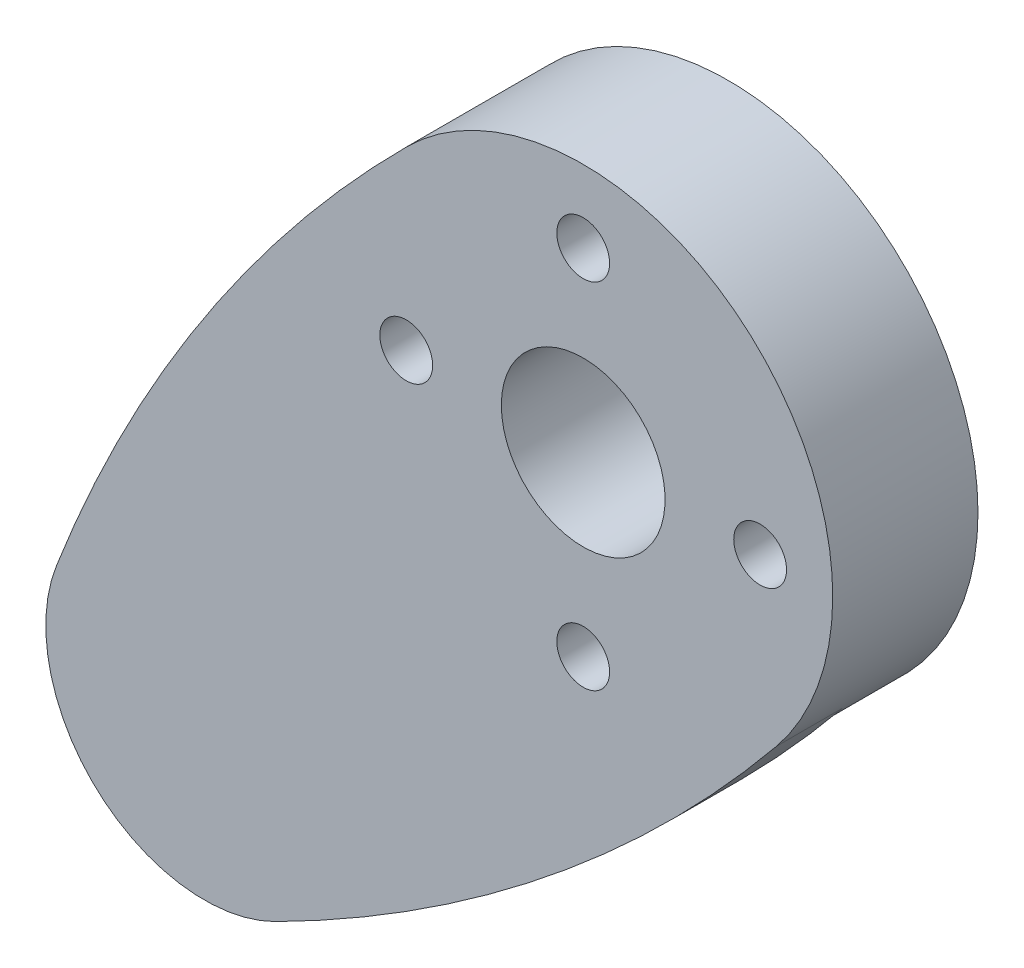
ISO-10303-21;
HEADER;
FILE_DESCRIPTION(('STEP AP214'),'2;1');
FILE_NAME('part.step','',(''),(''),'','','');
FILE_SCHEMA(('AUTOMOTIVE_DESIGN { 1 0 10303 214 1 1 1 1 }'));
ENDSEC;
DATA;
#1=APPLICATION_CONTEXT('core data for automotive mechanical design processes');
#2=APPLICATION_PROTOCOL_DEFINITION('international standard','automotive_design',2000,#1);
#3=PRODUCT_CONTEXT('',#1,'mechanical');
#4=PRODUCT('Part','Part','',(#3));
#5=PRODUCT_RELATED_PRODUCT_CATEGORY('part','',(#4));
#6=PRODUCT_DEFINITION_FORMATION('','',#4);
#7=PRODUCT_DEFINITION_CONTEXT('part definition',#1,'design');
#8=PRODUCT_DEFINITION('design','',#6,#7);
#9=PRODUCT_DEFINITION_SHAPE('','',#8);
#10=(LENGTH_UNIT() NAMED_UNIT(*) SI_UNIT(.MILLI.,.METRE.));
#11=(NAMED_UNIT(*) PLANE_ANGLE_UNIT() SI_UNIT($,.RADIAN.));
#12=(NAMED_UNIT(*) SI_UNIT($,.STERADIAN.) SOLID_ANGLE_UNIT());
#13=UNCERTAINTY_MEASURE_WITH_UNIT(LENGTH_MEASURE(1.E-05),#10,'distance_accuracy_value','');
#14=(GEOMETRIC_REPRESENTATION_CONTEXT(3) GLOBAL_UNCERTAINTY_ASSIGNED_CONTEXT((#13)) GLOBAL_UNIT_ASSIGNED_CONTEXT((#10,
#11,#12)) REPRESENTATION_CONTEXT('',''));
#15=CARTESIAN_POINT('',(0.,0.,0.));
#16=DIRECTION('',(0.,0.,1.));
#17=DIRECTION('',(1.,0.,0.));
#18=AXIS2_PLACEMENT_3D('',#15,#16,#17);
#19=CARTESIAN_POINT('',(86.267181183115,31.8764422805925,3.175));
#20=DIRECTION('',(0.,0.,-1.));
#21=DIRECTION('',(-1.,0.,0.));
#22=AXIS2_PLACEMENT_3D('',#19,#20,#21);
#23=CYLINDRICAL_SURFACE('',#22,7.62);
#24=CARTESIAN_POINT('',(86.267181183115,31.8764422805925,0.));
#25=DIRECTION('',(0.,0.,1.));
#26=DIRECTION('',(1.,0.,0.));
#27=AXIS2_PLACEMENT_3D('',#24,#25,#26);
#28=CIRCLE('',#27,7.62);
#29=CARTESIAN_POINT('',(79.1569800917538,34.6167781068018,0.));
#30=VERTEX_POINT('',#29);
#31=CARTESIAN_POINT('',(89.6996934055385,25.073335648846,0.));
#32=VERTEX_POINT('',#31);
#33=EDGE_CURVE('E83',#30,#32,#28,.T.);
#34=ORIENTED_EDGE('',*,*,#33,.T.);
#35=DIRECTION('',(0.,0.,-1.));
#36=VECTOR('',#35,1.);
#37=CARTESIAN_POINT('',(89.6996934055385,25.073335648846,3.175));
#38=LINE('',#37,#36);
#39=CARTESIAN_POINT('',(89.6996934055385,25.073335648846,3.175));
#40=VERTEX_POINT('',#39);
#41=EDGE_CURVE('E43',#40,#32,#38,.T.);
#42=ORIENTED_EDGE('',*,*,#41,.F.);
#43=CARTESIAN_POINT('',(86.267181183115,31.8764422805925,3.175));
#44=DIRECTION('',(0.,0.,1.));
#45=DIRECTION('',(1.,0.,0.));
#46=AXIS2_PLACEMENT_3D('',#43,#44,#45);
#47=CIRCLE('',#46,7.62);
#48=CARTESIAN_POINT('',(79.1569800917538,34.6167781068018,3.175));
#49=VERTEX_POINT('',#48);
#50=EDGE_CURVE('E84',#49,#40,#47,.T.);
#51=ORIENTED_EDGE('',*,*,#50,.F.);
#52=DIRECTION('',(0.,0.,-1.));
#53=VECTOR('',#52,1.);
#54=CARTESIAN_POINT('',(79.1569800917538,34.6167781068018,3.175));
#55=LINE('',#54,#53);
#56=EDGE_CURVE('E93',#49,#30,#55,.T.);
#57=ORIENTED_EDGE('',*,*,#56,.T.);
#58=EDGE_LOOP('',(#34,#42,#51,#57));
#59=FACE_BOUND('',#58,.T.);
#60=ADVANCED_FACE('F34',(#59),#23,.T.);
#61=CARTESIAN_POINT('',(56.2259574728493,91.4169872243178,3.175));
#62=DIRECTION('',(0.,0.,-1.));
#63=DIRECTION('',(-1.,0.,0.));
#64=AXIS2_PLACEMENT_3D('',#61,#62,#63);
#65=CYLINDRICAL_SURFACE('',#64,74.3099663683076);
#66=CARTESIAN_POINT('',(56.2259574728493,91.4169872243178,0.));
#67=DIRECTION('',(0.,0.,1.));
#68=DIRECTION('',(1.,0.,0.));
#69=AXIS2_PLACEMENT_3D('',#66,#67,#68);
#70=CIRCLE('',#69,74.3099663683076);
#71=CARTESIAN_POINT('',(113.784063399555,44.416609100422,0.));
#72=VERTEX_POINT('',#71);
#73=EDGE_CURVE('E85',#32,#72,#70,.T.);
#74=ORIENTED_EDGE('',*,*,#73,.T.);
#75=DIRECTION('',(0.,0.,-1.));
#76=VECTOR('',#75,1.);
#77=CARTESIAN_POINT('',(113.784063399555,44.416609100422,3.175));
#78=LINE('',#77,#76);
#79=CARTESIAN_POINT('',(113.784063399555,44.416609100422,3.175));
#80=VERTEX_POINT('',#79);
#81=EDGE_CURVE('E92',#80,#72,#78,.T.);
#82=ORIENTED_EDGE('',*,*,#81,.F.);
#83=CARTESIAN_POINT('',(56.2259574728493,91.4169872243178,3.175));
#84=DIRECTION('',(0.,0.,1.));
#85=DIRECTION('',(1.,0.,0.));
#86=AXIS2_PLACEMENT_3D('',#83,#84,#85);
#87=CIRCLE('',#86,74.3099663683076);
#88=EDGE_CURVE('E78',#40,#80,#87,.T.);
#89=ORIENTED_EDGE('',*,*,#88,.F.);
#90=ORIENTED_EDGE('',*,*,#41,.T.);
#91=EDGE_LOOP('',(#74,#82,#89,#90));
#92=FACE_BOUND('',#91,.T.);
#93=ADVANCED_FACE('F167',(#92),#65,.T.);
#94=CARTESIAN_POINT('',(104.489250000002,52.0064999999998,3.175));
#95=DIRECTION('',(0.,0.,-1.));
#96=DIRECTION('',(-1.,0.,0.));
#97=AXIS2_PLACEMENT_3D('',#94,#95,#96);
#98=CYLINDRICAL_SURFACE('',#97,12.);
#99=ORIENTED_EDGE('',*,*,#81,.T.);
#100=CARTESIAN_POINT('',(104.489250000002,52.0064999999998,0.));
#101=DIRECTION('',(0.,0.,-1.));
#102=DIRECTION('',(-1.,0.,0.));
#103=AXIS2_PLACEMENT_3D('',#100,#101,#102);
#104=CIRCLE('',#103,11.9999999999777);
#105=CARTESIAN_POINT('',(96.0142996751322,60.5020998605423,0.));
#106=VERTEX_POINT('',#105);
#107=EDGE_CURVE('E11',#72,#106,#104,.T.);
#108=ORIENTED_EDGE('',*,*,#107,.T.);
#109=DIRECTION('',(0.,0.,-1.));
#110=VECTOR('',#109,1.);
#111=CARTESIAN_POINT('',(96.0142996751162,60.5020998605583,3.175));
#112=LINE('',#111,#110);
#113=CARTESIAN_POINT('',(96.0142996751162,60.5020998605583,3.175));
#114=VERTEX_POINT('',#113);
#115=EDGE_CURVE('E88',#114,#106,#112,.T.);
#116=ORIENTED_EDGE('',*,*,#115,.F.);
#117=CARTESIAN_POINT('',(104.489250000002,52.0064999999998,3.175));
#118=DIRECTION('',(0.,0.,1.));
#119=DIRECTION('',(1.,0.,0.));
#120=AXIS2_PLACEMENT_3D('',#117,#118,#119);
#121=CIRCLE('',#120,12.);
#122=EDGE_CURVE('E98',#80,#114,#121,.T.);
#123=ORIENTED_EDGE('',*,*,#122,.F.);
#124=EDGE_LOOP('',(#99,#108,#116,#123));
#125=FACE_BOUND('',#124,.T.);
#126=CARTESIAN_POINT('',(104.489250000002,52.0064999999998,-3.81));
#127=DIRECTION('',(0.,0.,-1.));
#128=DIRECTION('',(-1.,0.,0.));
#129=AXIS2_PLACEMENT_3D('',#126,#127,#128);
#130=CIRCLE('',#129,11.9999999999777);
#131=CARTESIAN_POINT('',(92.4892500000245,52.0064999999998,-3.81));
#132=VERTEX_POINT('',#131);
#133=EDGE_CURVE('E112',#132,#132,#130,.T.);
#134=ORIENTED_EDGE('',*,*,#133,.F.);
#135=EDGE_LOOP('',(#134));
#136=FACE_BOUND('',#135,.T.);
#137=ADVANCED_FACE('F96',(#125,#136),#98,.T.);
#138=CARTESIAN_POINT('',(148.495405809727,7.8931215341666,3.175));
#139=DIRECTION('',(0.,0.,-1.));
#140=DIRECTION('',(-1.,0.,0.));
#141=AXIS2_PLACEMENT_3D('',#138,#139,#140);
#142=CYLINDRICAL_SURFACE('',#141,74.3099663683076);
#143=CARTESIAN_POINT('',(148.495405809727,7.8931215341666,0.));
#144=DIRECTION('',(0.,0.,1.));
#145=DIRECTION('',(1.,0.,0.));
#146=AXIS2_PLACEMENT_3D('',#143,#144,#145);
#147=CIRCLE('',#146,74.3099663683076);
#148=EDGE_CURVE('E70',#106,#30,#147,.T.);
#149=ORIENTED_EDGE('',*,*,#148,.T.);
#150=ORIENTED_EDGE('',*,*,#56,.F.);
#151=CARTESIAN_POINT('',(148.495405809727,7.8931215341666,3.175));
#152=DIRECTION('',(0.,0.,1.));
#153=DIRECTION('',(1.,0.,0.));
#154=AXIS2_PLACEMENT_3D('',#151,#152,#153);
#155=CIRCLE('',#154,74.3099663683076);
#156=EDGE_CURVE('E52',#114,#49,#155,.T.);
#157=ORIENTED_EDGE('',*,*,#156,.F.);
#158=ORIENTED_EDGE('',*,*,#115,.T.);
#159=EDGE_LOOP('',(#149,#150,#157,#158));
#160=FACE_BOUND('',#159,.T.);
#161=ADVANCED_FACE('F89',(#160),#142,.T.);
#162=CARTESIAN_POINT('',(0.,0.,3.175));
#163=DIRECTION('',(0.,0.,1.));
#164=DIRECTION('',(1.,0.,0.));
#165=AXIS2_PLACEMENT_3D('',#162,#163,#164);
#166=PLANE('',#165);
#167=CARTESIAN_POINT('',(104.489250000002,43.4974999999998,3.175));
#168=DIRECTION('',(0.,0.,1.));
#169=DIRECTION('',(1.,0.,0.));
#170=AXIS2_PLACEMENT_3D('',#167,#168,#169);
#171=CIRCLE('',#170,1.26999999998563);
#172=CARTESIAN_POINT('',(103.219250000017,43.4974999999998,3.175));
#173=VERTEX_POINT('',#172);
#174=EDGE_CURVE('E143',#173,#173,#171,.T.);
#175=ORIENTED_EDGE('',*,*,#174,.F.);
#176=EDGE_LOOP('',(#175));
#177=FACE_BOUND('',#176,.T.);
#178=CARTESIAN_POINT('',(104.489250000002,60.5154999999998,3.175));
#179=DIRECTION('',(0.,0.,1.));
#180=DIRECTION('',(1.,0.,0.));
#181=AXIS2_PLACEMENT_3D('',#178,#179,#180);
#182=CIRCLE('',#181,1.26999999998563);
#183=CARTESIAN_POINT('',(103.219250000017,60.5154999999998,3.175));
#184=VERTEX_POINT('',#183);
#185=EDGE_CURVE('E137',#184,#184,#182,.T.);
#186=ORIENTED_EDGE('',*,*,#185,.F.);
#187=EDGE_LOOP('',(#186));
#188=FACE_BOUND('',#187,.T.);
#189=CARTESIAN_POINT('',(95.9802500000022,52.0064999999998,3.175));
#190=DIRECTION('',(0.,0.,1.));
#191=DIRECTION('',(1.,0.,0.));
#192=AXIS2_PLACEMENT_3D('',#189,#190,#191);
#193=CIRCLE('',#192,1.26999999998564);
#194=CARTESIAN_POINT('',(94.7102500000166,52.0064999999998,3.175));
#195=VERTEX_POINT('',#194);
#196=EDGE_CURVE('E131',#195,#195,#193,.T.);
#197=ORIENTED_EDGE('',*,*,#196,.F.);
#198=EDGE_LOOP('',(#197));
#199=FACE_BOUND('',#198,.T.);
#200=CARTESIAN_POINT('',(112.998250000002,52.0064999999998,3.175));
#201=DIRECTION('',(0.,0.,1.));
#202=DIRECTION('',(1.,0.,0.));
#203=AXIS2_PLACEMENT_3D('',#200,#201,#202);
#204=CIRCLE('',#203,1.26999999998566);
#205=CARTESIAN_POINT('',(111.728250000017,52.0064999999998,3.175));
#206=VERTEX_POINT('',#205);
#207=EDGE_CURVE('E125',#206,#206,#204,.T.);
#208=ORIENTED_EDGE('',*,*,#207,.F.);
#209=EDGE_LOOP('',(#208));
#210=FACE_BOUND('',#209,.T.);
#211=CARTESIAN_POINT('',(104.489250000002,52.0064999999998,3.175));
#212=DIRECTION('',(0.,0.,1.));
#213=DIRECTION('',(1.,0.,0.));
#214=AXIS2_PLACEMENT_3D('',#211,#212,#213);
#215=CIRCLE('',#214,3.93699999998565);
#216=CARTESIAN_POINT('',(100.552250000017,52.0064999999998,3.175));
#217=VERTEX_POINT('',#216);
#218=EDGE_CURVE('E119',#217,#217,#215,.T.);
#219=ORIENTED_EDGE('',*,*,#218,.F.);
#220=EDGE_LOOP('',(#219));
#221=FACE_BOUND('',#220,.T.);
#222=ORIENTED_EDGE('',*,*,#50,.T.);
#223=ORIENTED_EDGE('',*,*,#88,.T.);
#224=ORIENTED_EDGE('',*,*,#122,.T.);
#225=ORIENTED_EDGE('',*,*,#156,.T.);
#226=EDGE_LOOP('',(#222,#223,#224,#225));
#227=FACE_BOUND('',#226,.T.);
#228=ADVANCED_FACE('F173',(#177,#188,#199,#210,#221,#227),#166,.T.);
#229=CARTESIAN_POINT('',(0.,0.,0.));
#230=DIRECTION('',(0.,0.,1.));
#231=DIRECTION('',(1.,0.,0.));
#232=AXIS2_PLACEMENT_3D('',#229,#230,#231);
#233=PLANE('',#232);
#234=ORIENTED_EDGE('',*,*,#107,.F.);
#235=ORIENTED_EDGE('',*,*,#73,.F.);
#236=ORIENTED_EDGE('',*,*,#33,.F.);
#237=ORIENTED_EDGE('',*,*,#148,.F.);
#238=EDGE_LOOP('',(#234,#235,#236,#237));
#239=FACE_BOUND('',#238,.T.);
#240=ADVANCED_FACE('F81',(#239),#233,.F.);
#241=CARTESIAN_POINT('',(104.489250000002,52.0064999999998,-3.81));
#242=DIRECTION('',(0.,0.,-1.));
#243=DIRECTION('',(-1.,0.,0.));
#244=AXIS2_PLACEMENT_3D('',#241,#242,#243);
#245=PLANE('',#244);
#246=CARTESIAN_POINT('',(104.489250000002,43.4974999999998,-3.81));
#247=DIRECTION('',(0.,0.,-1.));
#248=DIRECTION('',(-1.,0.,0.));
#249=AXIS2_PLACEMENT_3D('',#246,#247,#248);
#250=CIRCLE('',#249,1.26999999998563);
#251=CARTESIAN_POINT('',(103.219250000017,43.4974999999998,-3.81));
#252=VERTEX_POINT('',#251);
#253=EDGE_CURVE('E146',#252,#252,#250,.T.);
#254=ORIENTED_EDGE('',*,*,#253,.F.);
#255=EDGE_LOOP('',(#254));
#256=FACE_BOUND('',#255,.T.);
#257=CARTESIAN_POINT('',(104.489250000002,60.5154999999998,-3.81));
#258=DIRECTION('',(0.,0.,-1.));
#259=DIRECTION('',(-1.,0.,0.));
#260=AXIS2_PLACEMENT_3D('',#257,#258,#259);
#261=CIRCLE('',#260,1.26999999998563);
#262=CARTESIAN_POINT('',(103.219250000017,60.5154999999998,-3.81));
#263=VERTEX_POINT('',#262);
#264=EDGE_CURVE('E140',#263,#263,#261,.T.);
#265=ORIENTED_EDGE('',*,*,#264,.F.);
#266=EDGE_LOOP('',(#265));
#267=FACE_BOUND('',#266,.T.);
#268=CARTESIAN_POINT('',(95.9802500000022,52.0064999999998,-3.81));
#269=DIRECTION('',(0.,0.,-1.));
#270=DIRECTION('',(-1.,0.,0.));
#271=AXIS2_PLACEMENT_3D('',#268,#269,#270);
#272=CIRCLE('',#271,1.26999999998564);
#273=CARTESIAN_POINT('',(94.7102500000166,52.0064999999998,-3.81));
#274=VERTEX_POINT('',#273);
#275=EDGE_CURVE('E134',#274,#274,#272,.T.);
#276=ORIENTED_EDGE('',*,*,#275,.F.);
#277=EDGE_LOOP('',(#276));
#278=FACE_BOUND('',#277,.T.);
#279=CARTESIAN_POINT('',(112.998250000002,52.0064999999998,-3.81));
#280=DIRECTION('',(0.,0.,-1.));
#281=DIRECTION('',(-1.,0.,0.));
#282=AXIS2_PLACEMENT_3D('',#279,#280,#281);
#283=CIRCLE('',#282,1.26999999998566);
#284=CARTESIAN_POINT('',(111.728250000017,52.0064999999998,-3.81));
#285=VERTEX_POINT('',#284);
#286=EDGE_CURVE('E128',#285,#285,#283,.T.);
#287=ORIENTED_EDGE('',*,*,#286,.F.);
#288=EDGE_LOOP('',(#287));
#289=FACE_BOUND('',#288,.T.);
#290=CARTESIAN_POINT('',(104.489250000002,52.0064999999998,-3.81));
#291=DIRECTION('',(0.,0.,-1.));
#292=DIRECTION('',(-1.,0.,0.));
#293=AXIS2_PLACEMENT_3D('',#290,#291,#292);
#294=CIRCLE('',#293,3.93699999998565);
#295=CARTESIAN_POINT('',(100.552250000017,52.0064999999998,-3.81));
#296=VERTEX_POINT('',#295);
#297=EDGE_CURVE('E122',#296,#296,#294,.T.);
#298=ORIENTED_EDGE('',*,*,#297,.F.);
#299=EDGE_LOOP('',(#298));
#300=FACE_BOUND('',#299,.T.);
#301=ORIENTED_EDGE('',*,*,#133,.T.);
#302=EDGE_LOOP('',(#301));
#303=FACE_BOUND('',#302,.T.);
#304=ADVANCED_FACE('F152',(#256,#267,#278,#289,#300,#303),#245,.T.);
#305=CARTESIAN_POINT('',(104.489250000002,52.0064999999998,3.175025));
#306=DIRECTION('',(0.,0.,-1.));
#307=DIRECTION('',(-1.,0.,0.));
#308=AXIS2_PLACEMENT_3D('',#305,#306,#307);
#309=CYLINDRICAL_SURFACE('',#308,3.93699999998565);
#310=CARTESIAN_POINT('',(100.552250000017,52.0064999999998,3.175));
#311=CARTESIAN_POINT('',(100.552250000017,52.0064999999998,3.10223958333333));
#312=CARTESIAN_POINT('',(100.552250000017,52.0064999999998,3.02947916666667));
#313=CARTESIAN_POINT('',(100.552250000017,52.0064999999998,2.88395833333333));
#314=CARTESIAN_POINT('',(100.552250000017,52.0064999999998,2.81119791666667));
#315=CARTESIAN_POINT('',(100.552250000017,52.0064999999998,2.66567708333333));
#316=CARTESIAN_POINT('',(100.552250000017,52.0064999999998,2.59291666666667));
#317=CARTESIAN_POINT('',(100.552250000017,52.0064999999998,2.44739583333333));
#318=CARTESIAN_POINT('',(100.552250000017,52.0064999999998,2.37463541666667));
#319=CARTESIAN_POINT('',(100.552250000017,52.0064999999998,2.22911458333333));
#320=CARTESIAN_POINT('',(100.552250000017,52.0064999999998,2.15635416666667));
#321=CARTESIAN_POINT('',(100.552250000017,52.0064999999998,2.01083333333333));
#322=CARTESIAN_POINT('',(100.552250000017,52.0064999999998,1.93807291666667));
#323=CARTESIAN_POINT('',(100.552250000017,52.0064999999998,1.79255208333333));
#324=CARTESIAN_POINT('',(100.552250000017,52.0064999999998,1.71979166666667));
#325=CARTESIAN_POINT('',(100.552250000017,52.0064999999998,1.57427083333333));
#326=CARTESIAN_POINT('',(100.552250000017,52.0064999999998,1.50151041666667));
#327=CARTESIAN_POINT('',(100.552250000017,52.0064999999998,1.35598958333333));
#328=CARTESIAN_POINT('',(100.552250000017,52.0064999999998,1.28322916666667));
#329=CARTESIAN_POINT('',(100.552250000017,52.0064999999998,1.13770833333333));
#330=CARTESIAN_POINT('',(100.552250000017,52.0064999999998,1.06494791666667));
#331=CARTESIAN_POINT('',(100.552250000017,52.0064999999998,0.919427083333334));
#332=CARTESIAN_POINT('',(100.552250000017,52.0064999999998,0.846666666666667));
#333=CARTESIAN_POINT('',(100.552250000017,52.0064999999998,0.701145833333334));
#334=CARTESIAN_POINT('',(100.552250000017,52.0064999999998,0.628385416666667));
#335=CARTESIAN_POINT('',(100.552250000017,52.0064999999998,0.482864583333334));
#336=CARTESIAN_POINT('',(100.552250000017,52.0064999999998,0.410104166666667));
#337=CARTESIAN_POINT('',(100.552250000017,52.0064999999998,0.264583333333334));
#338=CARTESIAN_POINT('',(100.552250000017,52.0064999999998,0.191822916666667));
#339=CARTESIAN_POINT('',(100.552250000017,52.0064999999998,0.0463020833333337));
#340=CARTESIAN_POINT('',(100.552250000017,52.0064999999998,-0.0264583333333329));
#341=CARTESIAN_POINT('',(100.552250000017,52.0064999999998,-0.171979166666666));
#342=CARTESIAN_POINT('',(100.552250000017,52.0064999999998,-0.244739583333333));
#343=CARTESIAN_POINT('',(100.552250000017,52.0064999999998,-0.390260416666666));
#344=CARTESIAN_POINT('',(100.552250000017,52.0064999999998,-0.463020833333333));
#345=CARTESIAN_POINT('',(100.552250000017,52.0064999999998,-0.608541666666666));
#346=CARTESIAN_POINT('',(100.552250000017,52.0064999999998,-0.681302083333333));
#347=CARTESIAN_POINT('',(100.552250000017,52.0064999999998,-0.826822916666666));
#348=CARTESIAN_POINT('',(100.552250000017,52.0064999999998,-0.899583333333332));
#349=CARTESIAN_POINT('',(100.552250000017,52.0064999999998,-1.04510416666667));
#350=CARTESIAN_POINT('',(100.552250000017,52.0064999999998,-1.11786458333333));
#351=CARTESIAN_POINT('',(100.552250000017,52.0064999999998,-1.26338541666667));
#352=CARTESIAN_POINT('',(100.552250000017,52.0064999999998,-1.33614583333333));
#353=CARTESIAN_POINT('',(100.552250000017,52.0064999999998,-1.48166666666667));
#354=CARTESIAN_POINT('',(100.552250000017,52.0064999999998,-1.55442708333333));
#355=CARTESIAN_POINT('',(100.552250000017,52.0064999999998,-1.69994791666667));
#356=CARTESIAN_POINT('',(100.552250000017,52.0064999999998,-1.77270833333333));
#357=CARTESIAN_POINT('',(100.552250000017,52.0064999999998,-1.91822916666667));
#358=CARTESIAN_POINT('',(100.552250000017,52.0064999999998,-1.99098958333333));
#359=CARTESIAN_POINT('',(100.552250000017,52.0064999999998,-2.13651041666667));
#360=CARTESIAN_POINT('',(100.552250000017,52.0064999999998,-2.20927083333333));
#361=CARTESIAN_POINT('',(100.552250000017,52.0064999999998,-2.35479166666667));
#362=CARTESIAN_POINT('',(100.552250000017,52.0064999999998,-2.42755208333333));
#363=CARTESIAN_POINT('',(100.552250000017,52.0064999999998,-2.57307291666667));
#364=CARTESIAN_POINT('',(100.552250000017,52.0064999999998,-2.64583333333333));
#365=CARTESIAN_POINT('',(100.552250000017,52.0064999999998,-2.79135416666667));
#366=CARTESIAN_POINT('',(100.552250000017,52.0064999999998,-2.86411458333333));
#367=CARTESIAN_POINT('',(100.552250000017,52.0064999999998,-3.00963541666667));
#368=CARTESIAN_POINT('',(100.552250000017,52.0064999999998,-3.08239583333333));
#369=CARTESIAN_POINT('',(100.552250000017,52.0064999999998,-3.22791666666667));
#370=CARTESIAN_POINT('',(100.552250000017,52.0064999999998,-3.30067708333333));
#371=CARTESIAN_POINT('',(100.552250000017,52.0064999999998,-3.44619791666666));
#372=CARTESIAN_POINT('',(100.552250000017,52.0064999999998,-3.51895833333333));
#373=CARTESIAN_POINT('',(100.552250000017,52.0064999999998,-3.66447916666667));
#374=CARTESIAN_POINT('',(100.552250000017,52.0064999999998,-3.73723958333333));
#375=CARTESIAN_POINT('',(100.552250000017,52.0064999999998,-3.81));
#376=B_SPLINE_CURVE_WITH_KNOTS('',3,(#310,#311,#312,#313,#314,#315,#316,#317,#318,#319,#320,
#321,#322,#323,#324,#325,#326,#327,#328,#329,#330,#331,#332,#333,#334,#335,#336,#337,#338,#339,
#340,#341,#342,#343,#344,#345,#346,#347,#348,#349,#350,#351,#352,#353,#354,#355,#356,#357,#358,
#359,#360,#361,#362,#363,#364,#365,#366,#367,#368,#369,#370,#371,#372,#373,#374,#375),
.UNSPECIFIED.,.F.,.F.,(4,2,2,2,2,2,2,2,2,2,2,2,2,2,2,2,2,2,2,2,2,2,2,2,2,2,2,2,2,2,2,2,4),(0.,
0.21828125,0.4365625,0.65484375,0.873124999999999,1.09140625,1.3096875,1.52796875,1.74625,
1.96453125,2.1828125,2.40109375,2.619375,2.83765625,3.0559375,3.27421875,3.4925,3.71078125,
3.9290625,4.14734375,4.365625,4.58390625,4.8021875,5.02046875,5.23875,5.45703125,5.6753125,
5.89359375,6.111875,6.33015625,6.5484375,6.76671875,6.985),.UNSPECIFIED.);
#377=EDGE_CURVE('BSEAM155',#217,#296,#376,.T.);
#378=ORIENTED_EDGE('',*,*,#218,.T.);
#379=ORIENTED_EDGE('',*,*,#297,.T.);
#380=ORIENTED_EDGE('',*,*,#377,.T.);
#381=ORIENTED_EDGE('',*,*,#377,.F.);
#382=EDGE_LOOP('',(#378,#380,#379,#381));
#383=FACE_BOUND('',#382,.T.);
#384=ADVANCED_FACE('F155',(#383),#309,.F.);
#385=CARTESIAN_POINT('',(112.998250000002,52.0064999999998,3.175025));
#386=DIRECTION('',(0.,0.,-1.));
#387=DIRECTION('',(-1.,0.,0.));
#388=AXIS2_PLACEMENT_3D('',#385,#386,#387);
#389=CYLINDRICAL_SURFACE('',#388,1.26999999998566);
#390=CARTESIAN_POINT('',(111.728250000017,52.0064999999998,3.175));
#391=CARTESIAN_POINT('',(111.728250000017,52.0064999999998,3.10223958333333));
#392=CARTESIAN_POINT('',(111.728250000017,52.0064999999998,3.02947916666667));
#393=CARTESIAN_POINT('',(111.728250000017,52.0064999999998,2.88395833333333));
#394=CARTESIAN_POINT('',(111.728250000017,52.0064999999998,2.81119791666667));
#395=CARTESIAN_POINT('',(111.728250000017,52.0064999999998,2.66567708333333));
#396=CARTESIAN_POINT('',(111.728250000017,52.0064999999998,2.59291666666667));
#397=CARTESIAN_POINT('',(111.728250000017,52.0064999999998,2.44739583333333));
#398=CARTESIAN_POINT('',(111.728250000017,52.0064999999998,2.37463541666667));
#399=CARTESIAN_POINT('',(111.728250000017,52.0064999999998,2.22911458333333));
#400=CARTESIAN_POINT('',(111.728250000017,52.0064999999998,2.15635416666667));
#401=CARTESIAN_POINT('',(111.728250000017,52.0064999999998,2.01083333333333));
#402=CARTESIAN_POINT('',(111.728250000017,52.0064999999998,1.93807291666667));
#403=CARTESIAN_POINT('',(111.728250000017,52.0064999999998,1.79255208333333));
#404=CARTESIAN_POINT('',(111.728250000017,52.0064999999998,1.71979166666667));
#405=CARTESIAN_POINT('',(111.728250000017,52.0064999999998,1.57427083333333));
#406=CARTESIAN_POINT('',(111.728250000017,52.0064999999998,1.50151041666667));
#407=CARTESIAN_POINT('',(111.728250000017,52.0064999999998,1.35598958333333));
#408=CARTESIAN_POINT('',(111.728250000017,52.0064999999998,1.28322916666667));
#409=CARTESIAN_POINT('',(111.728250000017,52.0064999999998,1.13770833333333));
#410=CARTESIAN_POINT('',(111.728250000017,52.0064999999998,1.06494791666667));
#411=CARTESIAN_POINT('',(111.728250000017,52.0064999999998,0.919427083333334));
#412=CARTESIAN_POINT('',(111.728250000017,52.0064999999998,0.846666666666667));
#413=CARTESIAN_POINT('',(111.728250000017,52.0064999999998,0.701145833333334));
#414=CARTESIAN_POINT('',(111.728250000017,52.0064999999998,0.628385416666667));
#415=CARTESIAN_POINT('',(111.728250000017,52.0064999999998,0.482864583333334));
#416=CARTESIAN_POINT('',(111.728250000017,52.0064999999998,0.410104166666667));
#417=CARTESIAN_POINT('',(111.728250000017,52.0064999999998,0.264583333333334));
#418=CARTESIAN_POINT('',(111.728250000017,52.0064999999998,0.191822916666667));
#419=CARTESIAN_POINT('',(111.728250000017,52.0064999999998,0.0463020833333337));
#420=CARTESIAN_POINT('',(111.728250000017,52.0064999999998,-0.0264583333333329));
#421=CARTESIAN_POINT('',(111.728250000017,52.0064999999998,-0.171979166666666));
#422=CARTESIAN_POINT('',(111.728250000017,52.0064999999998,-0.244739583333333));
#423=CARTESIAN_POINT('',(111.728250000017,52.0064999999998,-0.390260416666666));
#424=CARTESIAN_POINT('',(111.728250000017,52.0064999999998,-0.463020833333333));
#425=CARTESIAN_POINT('',(111.728250000017,52.0064999999998,-0.608541666666666));
#426=CARTESIAN_POINT('',(111.728250000017,52.0064999999998,-0.681302083333333));
#427=CARTESIAN_POINT('',(111.728250000017,52.0064999999998,-0.826822916666666));
#428=CARTESIAN_POINT('',(111.728250000017,52.0064999999998,-0.899583333333332));
#429=CARTESIAN_POINT('',(111.728250000017,52.0064999999998,-1.04510416666667));
#430=CARTESIAN_POINT('',(111.728250000017,52.0064999999998,-1.11786458333333));
#431=CARTESIAN_POINT('',(111.728250000017,52.0064999999998,-1.26338541666667));
#432=CARTESIAN_POINT('',(111.728250000017,52.0064999999998,-1.33614583333333));
#433=CARTESIAN_POINT('',(111.728250000017,52.0064999999998,-1.48166666666667));
#434=CARTESIAN_POINT('',(111.728250000017,52.0064999999998,-1.55442708333333));
#435=CARTESIAN_POINT('',(111.728250000017,52.0064999999998,-1.69994791666667));
#436=CARTESIAN_POINT('',(111.728250000017,52.0064999999998,-1.77270833333333));
#437=CARTESIAN_POINT('',(111.728250000017,52.0064999999998,-1.91822916666667));
#438=CARTESIAN_POINT('',(111.728250000017,52.0064999999998,-1.99098958333333));
#439=CARTESIAN_POINT('',(111.728250000017,52.0064999999998,-2.13651041666667));
#440=CARTESIAN_POINT('',(111.728250000017,52.0064999999998,-2.20927083333333));
#441=CARTESIAN_POINT('',(111.728250000017,52.0064999999998,-2.35479166666667));
#442=CARTESIAN_POINT('',(111.728250000017,52.0064999999998,-2.42755208333333));
#443=CARTESIAN_POINT('',(111.728250000017,52.0064999999998,-2.57307291666667));
#444=CARTESIAN_POINT('',(111.728250000017,52.0064999999998,-2.64583333333333));
#445=CARTESIAN_POINT('',(111.728250000017,52.0064999999998,-2.79135416666667));
#446=CARTESIAN_POINT('',(111.728250000017,52.0064999999998,-2.86411458333333));
#447=CARTESIAN_POINT('',(111.728250000017,52.0064999999998,-3.00963541666667));
#448=CARTESIAN_POINT('',(111.728250000017,52.0064999999998,-3.08239583333333));
#449=CARTESIAN_POINT('',(111.728250000017,52.0064999999998,-3.22791666666667));
#450=CARTESIAN_POINT('',(111.728250000017,52.0064999999998,-3.30067708333333));
#451=CARTESIAN_POINT('',(111.728250000017,52.0064999999998,-3.44619791666666));
#452=CARTESIAN_POINT('',(111.728250000017,52.0064999999998,-3.51895833333333));
#453=CARTESIAN_POINT('',(111.728250000017,52.0064999999998,-3.66447916666667));
#454=CARTESIAN_POINT('',(111.728250000017,52.0064999999998,-3.73723958333333));
#455=CARTESIAN_POINT('',(111.728250000017,52.0064999999998,-3.81));
#456=B_SPLINE_CURVE_WITH_KNOTS('',3,(#390,#391,#392,#393,#394,#395,#396,#397,#398,#399,#400,
#401,#402,#403,#404,#405,#406,#407,#408,#409,#410,#411,#412,#413,#414,#415,#416,#417,#418,#419,
#420,#421,#422,#423,#424,#425,#426,#427,#428,#429,#430,#431,#432,#433,#434,#435,#436,#437,#438,
#439,#440,#441,#442,#443,#444,#445,#446,#447,#448,#449,#450,#451,#452,#453,#454,#455),
.UNSPECIFIED.,.F.,.F.,(4,2,2,2,2,2,2,2,2,2,2,2,2,2,2,2,2,2,2,2,2,2,2,2,2,2,2,2,2,2,2,2,4),(0.,
0.21828125,0.4365625,0.65484375,0.873124999999999,1.09140625,1.3096875,1.52796875,1.74625,
1.96453125,2.1828125,2.40109375,2.619375,2.83765625,3.0559375,3.27421875,3.4925,3.71078125,
3.9290625,4.14734375,4.365625,4.58390625,4.8021875,5.02046875,5.23875,5.45703125,5.6753125,
5.89359375,6.111875,6.33015625,6.5484375,6.76671875,6.985),.UNSPECIFIED.);
#457=EDGE_CURVE('BSEAM193',#206,#285,#456,.T.);
#458=ORIENTED_EDGE('',*,*,#207,.T.);
#459=ORIENTED_EDGE('',*,*,#286,.T.);
#460=ORIENTED_EDGE('',*,*,#457,.T.);
#461=ORIENTED_EDGE('',*,*,#457,.F.);
#462=EDGE_LOOP('',(#458,#460,#459,#461));
#463=FACE_BOUND('',#462,.T.);
#464=ADVANCED_FACE('F193',(#463),#389,.F.);
#465=CARTESIAN_POINT('',(95.9802500000022,52.0064999999998,3.175025));
#466=DIRECTION('',(0.,0.,-1.));
#467=DIRECTION('',(-1.,0.,0.));
#468=AXIS2_PLACEMENT_3D('',#465,#466,#467);
#469=CYLINDRICAL_SURFACE('',#468,1.26999999998564);
#470=CARTESIAN_POINT('',(94.7102500000166,52.0064999999998,3.175));
#471=CARTESIAN_POINT('',(94.7102500000166,52.0064999999998,3.10223958333333));
#472=CARTESIAN_POINT('',(94.7102500000166,52.0064999999998,3.02947916666667));
#473=CARTESIAN_POINT('',(94.7102500000166,52.0064999999998,2.88395833333333));
#474=CARTESIAN_POINT('',(94.7102500000166,52.0064999999998,2.81119791666667));
#475=CARTESIAN_POINT('',(94.7102500000166,52.0064999999998,2.66567708333333));
#476=CARTESIAN_POINT('',(94.7102500000166,52.0064999999998,2.59291666666667));
#477=CARTESIAN_POINT('',(94.7102500000166,52.0064999999998,2.44739583333333));
#478=CARTESIAN_POINT('',(94.7102500000166,52.0064999999998,2.37463541666667));
#479=CARTESIAN_POINT('',(94.7102500000166,52.0064999999998,2.22911458333333));
#480=CARTESIAN_POINT('',(94.7102500000166,52.0064999999998,2.15635416666667));
#481=CARTESIAN_POINT('',(94.7102500000166,52.0064999999998,2.01083333333333));
#482=CARTESIAN_POINT('',(94.7102500000166,52.0064999999998,1.93807291666667));
#483=CARTESIAN_POINT('',(94.7102500000166,52.0064999999998,1.79255208333333));
#484=CARTESIAN_POINT('',(94.7102500000166,52.0064999999998,1.71979166666667));
#485=CARTESIAN_POINT('',(94.7102500000166,52.0064999999998,1.57427083333333));
#486=CARTESIAN_POINT('',(94.7102500000166,52.0064999999998,1.50151041666667));
#487=CARTESIAN_POINT('',(94.7102500000166,52.0064999999998,1.35598958333333));
#488=CARTESIAN_POINT('',(94.7102500000166,52.0064999999998,1.28322916666667));
#489=CARTESIAN_POINT('',(94.7102500000166,52.0064999999998,1.13770833333333));
#490=CARTESIAN_POINT('',(94.7102500000166,52.0064999999998,1.06494791666667));
#491=CARTESIAN_POINT('',(94.7102500000166,52.0064999999998,0.919427083333334));
#492=CARTESIAN_POINT('',(94.7102500000166,52.0064999999998,0.846666666666667));
#493=CARTESIAN_POINT('',(94.7102500000166,52.0064999999998,0.701145833333334));
#494=CARTESIAN_POINT('',(94.7102500000166,52.0064999999998,0.628385416666667));
#495=CARTESIAN_POINT('',(94.7102500000166,52.0064999999998,0.482864583333334));
#496=CARTESIAN_POINT('',(94.7102500000166,52.0064999999998,0.410104166666667));
#497=CARTESIAN_POINT('',(94.7102500000166,52.0064999999998,0.264583333333334));
#498=CARTESIAN_POINT('',(94.7102500000166,52.0064999999998,0.191822916666667));
#499=CARTESIAN_POINT('',(94.7102500000166,52.0064999999998,0.0463020833333337));
#500=CARTESIAN_POINT('',(94.7102500000166,52.0064999999998,-0.0264583333333329));
#501=CARTESIAN_POINT('',(94.7102500000166,52.0064999999998,-0.171979166666666));
#502=CARTESIAN_POINT('',(94.7102500000166,52.0064999999998,-0.244739583333333));
#503=CARTESIAN_POINT('',(94.7102500000166,52.0064999999998,-0.390260416666666));
#504=CARTESIAN_POINT('',(94.7102500000166,52.0064999999998,-0.463020833333333));
#505=CARTESIAN_POINT('',(94.7102500000166,52.0064999999998,-0.608541666666666));
#506=CARTESIAN_POINT('',(94.7102500000166,52.0064999999998,-0.681302083333333));
#507=CARTESIAN_POINT('',(94.7102500000166,52.0064999999998,-0.826822916666666));
#508=CARTESIAN_POINT('',(94.7102500000166,52.0064999999998,-0.899583333333332));
#509=CARTESIAN_POINT('',(94.7102500000166,52.0064999999998,-1.04510416666667));
#510=CARTESIAN_POINT('',(94.7102500000166,52.0064999999998,-1.11786458333333));
#511=CARTESIAN_POINT('',(94.7102500000166,52.0064999999998,-1.26338541666667));
#512=CARTESIAN_POINT('',(94.7102500000166,52.0064999999998,-1.33614583333333));
#513=CARTESIAN_POINT('',(94.7102500000166,52.0064999999998,-1.48166666666667));
#514=CARTESIAN_POINT('',(94.7102500000166,52.0064999999998,-1.55442708333333));
#515=CARTESIAN_POINT('',(94.7102500000166,52.0064999999998,-1.69994791666667));
#516=CARTESIAN_POINT('',(94.7102500000166,52.0064999999998,-1.77270833333333));
#517=CARTESIAN_POINT('',(94.7102500000166,52.0064999999998,-1.91822916666667));
#518=CARTESIAN_POINT('',(94.7102500000166,52.0064999999998,-1.99098958333333));
#519=CARTESIAN_POINT('',(94.7102500000166,52.0064999999998,-2.13651041666667));
#520=CARTESIAN_POINT('',(94.7102500000166,52.0064999999998,-2.20927083333333));
#521=CARTESIAN_POINT('',(94.7102500000166,52.0064999999998,-2.35479166666667));
#522=CARTESIAN_POINT('',(94.7102500000166,52.0064999999998,-2.42755208333333));
#523=CARTESIAN_POINT('',(94.7102500000166,52.0064999999998,-2.57307291666667));
#524=CARTESIAN_POINT('',(94.7102500000166,52.0064999999998,-2.64583333333333));
#525=CARTESIAN_POINT('',(94.7102500000166,52.0064999999998,-2.79135416666667));
#526=CARTESIAN_POINT('',(94.7102500000166,52.0064999999998,-2.86411458333333));
#527=CARTESIAN_POINT('',(94.7102500000166,52.0064999999998,-3.00963541666667));
#528=CARTESIAN_POINT('',(94.7102500000166,52.0064999999998,-3.08239583333333));
#529=CARTESIAN_POINT('',(94.7102500000166,52.0064999999998,-3.22791666666667));
#530=CARTESIAN_POINT('',(94.7102500000166,52.0064999999998,-3.30067708333333));
#531=CARTESIAN_POINT('',(94.7102500000166,52.0064999999998,-3.44619791666666));
#532=CARTESIAN_POINT('',(94.7102500000166,52.0064999999998,-3.51895833333333));
#533=CARTESIAN_POINT('',(94.7102500000166,52.0064999999998,-3.66447916666667));
#534=CARTESIAN_POINT('',(94.7102500000166,52.0064999999998,-3.73723958333333));
#535=CARTESIAN_POINT('',(94.7102500000166,52.0064999999998,-3.81));
#536=B_SPLINE_CURVE_WITH_KNOTS('',3,(#470,#471,#472,#473,#474,#475,#476,#477,#478,#479,#480,
#481,#482,#483,#484,#485,#486,#487,#488,#489,#490,#491,#492,#493,#494,#495,#496,#497,#498,#499,
#500,#501,#502,#503,#504,#505,#506,#507,#508,#509,#510,#511,#512,#513,#514,#515,#516,#517,#518,
#519,#520,#521,#522,#523,#524,#525,#526,#527,#528,#529,#530,#531,#532,#533,#534,#535),
.UNSPECIFIED.,.F.,.F.,(4,2,2,2,2,2,2,2,2,2,2,2,2,2,2,2,2,2,2,2,2,2,2,2,2,2,2,2,2,2,2,2,4),(0.,
0.21828125,0.4365625,0.65484375,0.873124999999999,1.09140625,1.3096875,1.52796875,1.74625,
1.96453125,2.1828125,2.40109375,2.619375,2.83765625,3.0559375,3.27421875,3.4925,3.71078125,
3.9290625,4.14734375,4.365625,4.58390625,4.8021875,5.02046875,5.23875,5.45703125,5.6753125,
5.89359375,6.111875,6.33015625,6.5484375,6.76671875,6.985),.UNSPECIFIED.);
#537=EDGE_CURVE('BSEAM197',#195,#274,#536,.T.);
#538=ORIENTED_EDGE('',*,*,#196,.T.);
#539=ORIENTED_EDGE('',*,*,#275,.T.);
#540=ORIENTED_EDGE('',*,*,#537,.T.);
#541=ORIENTED_EDGE('',*,*,#537,.F.);
#542=EDGE_LOOP('',(#538,#540,#539,#541));
#543=FACE_BOUND('',#542,.T.);
#544=ADVANCED_FACE('F197',(#543),#469,.F.);
#545=CARTESIAN_POINT('',(104.489250000002,60.5154999999998,3.175025));
#546=DIRECTION('',(0.,0.,-1.));
#547=DIRECTION('',(-1.,0.,0.));
#548=AXIS2_PLACEMENT_3D('',#545,#546,#547);
#549=CYLINDRICAL_SURFACE('',#548,1.26999999998563);
#550=CARTESIAN_POINT('',(103.219250000017,60.5154999999998,3.175));
#551=CARTESIAN_POINT('',(103.219250000017,60.5154999999998,3.10223958333333));
#552=CARTESIAN_POINT('',(103.219250000017,60.5154999999998,3.02947916666667));
#553=CARTESIAN_POINT('',(103.219250000017,60.5154999999998,2.88395833333333));
#554=CARTESIAN_POINT('',(103.219250000017,60.5154999999998,2.81119791666667));
#555=CARTESIAN_POINT('',(103.219250000017,60.5154999999998,2.66567708333333));
#556=CARTESIAN_POINT('',(103.219250000017,60.5154999999998,2.59291666666667));
#557=CARTESIAN_POINT('',(103.219250000017,60.5154999999998,2.44739583333333));
#558=CARTESIAN_POINT('',(103.219250000017,60.5154999999998,2.37463541666667));
#559=CARTESIAN_POINT('',(103.219250000017,60.5154999999998,2.22911458333333));
#560=CARTESIAN_POINT('',(103.219250000017,60.5154999999998,2.15635416666667));
#561=CARTESIAN_POINT('',(103.219250000017,60.5154999999998,2.01083333333333));
#562=CARTESIAN_POINT('',(103.219250000017,60.5154999999998,1.93807291666667));
#563=CARTESIAN_POINT('',(103.219250000017,60.5154999999998,1.79255208333333));
#564=CARTESIAN_POINT('',(103.219250000017,60.5154999999998,1.71979166666667));
#565=CARTESIAN_POINT('',(103.219250000017,60.5154999999998,1.57427083333333));
#566=CARTESIAN_POINT('',(103.219250000017,60.5154999999998,1.50151041666667));
#567=CARTESIAN_POINT('',(103.219250000017,60.5154999999998,1.35598958333333));
#568=CARTESIAN_POINT('',(103.219250000017,60.5154999999998,1.28322916666667));
#569=CARTESIAN_POINT('',(103.219250000017,60.5154999999998,1.13770833333333));
#570=CARTESIAN_POINT('',(103.219250000017,60.5154999999998,1.06494791666667));
#571=CARTESIAN_POINT('',(103.219250000017,60.5154999999998,0.919427083333334));
#572=CARTESIAN_POINT('',(103.219250000017,60.5154999999998,0.846666666666667));
#573=CARTESIAN_POINT('',(103.219250000017,60.5154999999998,0.701145833333334));
#574=CARTESIAN_POINT('',(103.219250000017,60.5154999999998,0.628385416666667));
#575=CARTESIAN_POINT('',(103.219250000017,60.5154999999998,0.482864583333334));
#576=CARTESIAN_POINT('',(103.219250000017,60.5154999999998,0.410104166666667));
#577=CARTESIAN_POINT('',(103.219250000017,60.5154999999998,0.264583333333334));
#578=CARTESIAN_POINT('',(103.219250000017,60.5154999999998,0.191822916666667));
#579=CARTESIAN_POINT('',(103.219250000017,60.5154999999998,0.0463020833333337));
#580=CARTESIAN_POINT('',(103.219250000017,60.5154999999998,-0.0264583333333329));
#581=CARTESIAN_POINT('',(103.219250000017,60.5154999999998,-0.171979166666666));
#582=CARTESIAN_POINT('',(103.219250000017,60.5154999999998,-0.244739583333333));
#583=CARTESIAN_POINT('',(103.219250000017,60.5154999999998,-0.390260416666666));
#584=CARTESIAN_POINT('',(103.219250000017,60.5154999999998,-0.463020833333333));
#585=CARTESIAN_POINT('',(103.219250000017,60.5154999999998,-0.608541666666666));
#586=CARTESIAN_POINT('',(103.219250000017,60.5154999999998,-0.681302083333333));
#587=CARTESIAN_POINT('',(103.219250000017,60.5154999999998,-0.826822916666666));
#588=CARTESIAN_POINT('',(103.219250000017,60.5154999999998,-0.899583333333332));
#589=CARTESIAN_POINT('',(103.219250000017,60.5154999999998,-1.04510416666667));
#590=CARTESIAN_POINT('',(103.219250000017,60.5154999999998,-1.11786458333333));
#591=CARTESIAN_POINT('',(103.219250000017,60.5154999999998,-1.26338541666667));
#592=CARTESIAN_POINT('',(103.219250000017,60.5154999999998,-1.33614583333333));
#593=CARTESIAN_POINT('',(103.219250000017,60.5154999999998,-1.48166666666667));
#594=CARTESIAN_POINT('',(103.219250000017,60.5154999999998,-1.55442708333333));
#595=CARTESIAN_POINT('',(103.219250000017,60.5154999999998,-1.69994791666667));
#596=CARTESIAN_POINT('',(103.219250000017,60.5154999999998,-1.77270833333333));
#597=CARTESIAN_POINT('',(103.219250000017,60.5154999999998,-1.91822916666667));
#598=CARTESIAN_POINT('',(103.219250000017,60.5154999999998,-1.99098958333333));
#599=CARTESIAN_POINT('',(103.219250000017,60.5154999999998,-2.13651041666667));
#600=CARTESIAN_POINT('',(103.219250000017,60.5154999999998,-2.20927083333333));
#601=CARTESIAN_POINT('',(103.219250000017,60.5154999999998,-2.35479166666667));
#602=CARTESIAN_POINT('',(103.219250000017,60.5154999999998,-2.42755208333333));
#603=CARTESIAN_POINT('',(103.219250000017,60.5154999999998,-2.57307291666667));
#604=CARTESIAN_POINT('',(103.219250000017,60.5154999999998,-2.64583333333333));
#605=CARTESIAN_POINT('',(103.219250000017,60.5154999999998,-2.79135416666667));
#606=CARTESIAN_POINT('',(103.219250000017,60.5154999999998,-2.86411458333333));
#607=CARTESIAN_POINT('',(103.219250000017,60.5154999999998,-3.00963541666667));
#608=CARTESIAN_POINT('',(103.219250000017,60.5154999999998,-3.08239583333333));
#609=CARTESIAN_POINT('',(103.219250000017,60.5154999999998,-3.22791666666667));
#610=CARTESIAN_POINT('',(103.219250000017,60.5154999999998,-3.30067708333333));
#611=CARTESIAN_POINT('',(103.219250000017,60.5154999999998,-3.44619791666666));
#612=CARTESIAN_POINT('',(103.219250000017,60.5154999999998,-3.51895833333333));
#613=CARTESIAN_POINT('',(103.219250000017,60.5154999999998,-3.66447916666667));
#614=CARTESIAN_POINT('',(103.219250000017,60.5154999999998,-3.73723958333333));
#615=CARTESIAN_POINT('',(103.219250000017,60.5154999999998,-3.81));
#616=B_SPLINE_CURVE_WITH_KNOTS('',3,(#550,#551,#552,#553,#554,#555,#556,#557,#558,#559,#560,
#561,#562,#563,#564,#565,#566,#567,#568,#569,#570,#571,#572,#573,#574,#575,#576,#577,#578,#579,
#580,#581,#582,#583,#584,#585,#586,#587,#588,#589,#590,#591,#592,#593,#594,#595,#596,#597,#598,
#599,#600,#601,#602,#603,#604,#605,#606,#607,#608,#609,#610,#611,#612,#613,#614,#615),
.UNSPECIFIED.,.F.,.F.,(4,2,2,2,2,2,2,2,2,2,2,2,2,2,2,2,2,2,2,2,2,2,2,2,2,2,2,2,2,2,2,2,4),(0.,
0.21828125,0.4365625,0.65484375,0.873124999999999,1.09140625,1.3096875,1.52796875,1.74625,
1.96453125,2.1828125,2.40109375,2.619375,2.83765625,3.0559375,3.27421875,3.4925,3.71078125,
3.9290625,4.14734375,4.365625,4.58390625,4.8021875,5.02046875,5.23875,5.45703125,5.6753125,
5.89359375,6.111875,6.33015625,6.5484375,6.76671875,6.985),.UNSPECIFIED.);
#617=EDGE_CURVE('BSEAM201',#184,#263,#616,.T.);
#618=ORIENTED_EDGE('',*,*,#185,.T.);
#619=ORIENTED_EDGE('',*,*,#264,.T.);
#620=ORIENTED_EDGE('',*,*,#617,.T.);
#621=ORIENTED_EDGE('',*,*,#617,.F.);
#622=EDGE_LOOP('',(#618,#620,#619,#621));
#623=FACE_BOUND('',#622,.T.);
#624=ADVANCED_FACE('F201',(#623),#549,.F.);
#625=CARTESIAN_POINT('',(104.489250000002,43.4974999999998,3.175025));
#626=DIRECTION('',(0.,0.,-1.));
#627=DIRECTION('',(-1.,0.,0.));
#628=AXIS2_PLACEMENT_3D('',#625,#626,#627);
#629=CYLINDRICAL_SURFACE('',#628,1.26999999998563);
#630=CARTESIAN_POINT('',(103.219250000017,43.4974999999998,3.175));
#631=CARTESIAN_POINT('',(103.219250000017,43.4974999999998,3.10223958333333));
#632=CARTESIAN_POINT('',(103.219250000017,43.4974999999998,3.02947916666667));
#633=CARTESIAN_POINT('',(103.219250000017,43.4974999999998,2.88395833333333));
#634=CARTESIAN_POINT('',(103.219250000017,43.4974999999998,2.81119791666667));
#635=CARTESIAN_POINT('',(103.219250000017,43.4974999999998,2.66567708333333));
#636=CARTESIAN_POINT('',(103.219250000017,43.4974999999998,2.59291666666667));
#637=CARTESIAN_POINT('',(103.219250000017,43.4974999999998,2.44739583333333));
#638=CARTESIAN_POINT('',(103.219250000017,43.4974999999998,2.37463541666667));
#639=CARTESIAN_POINT('',(103.219250000017,43.4974999999998,2.22911458333333));
#640=CARTESIAN_POINT('',(103.219250000017,43.4974999999998,2.15635416666667));
#641=CARTESIAN_POINT('',(103.219250000017,43.4974999999998,2.01083333333333));
#642=CARTESIAN_POINT('',(103.219250000017,43.4974999999998,1.93807291666667));
#643=CARTESIAN_POINT('',(103.219250000017,43.4974999999998,1.79255208333333));
#644=CARTESIAN_POINT('',(103.219250000017,43.4974999999998,1.71979166666667));
#645=CARTESIAN_POINT('',(103.219250000017,43.4974999999998,1.57427083333333));
#646=CARTESIAN_POINT('',(103.219250000017,43.4974999999998,1.50151041666667));
#647=CARTESIAN_POINT('',(103.219250000017,43.4974999999998,1.35598958333333));
#648=CARTESIAN_POINT('',(103.219250000017,43.4974999999998,1.28322916666667));
#649=CARTESIAN_POINT('',(103.219250000017,43.4974999999998,1.13770833333333));
#650=CARTESIAN_POINT('',(103.219250000017,43.4974999999998,1.06494791666667));
#651=CARTESIAN_POINT('',(103.219250000017,43.4974999999998,0.919427083333334));
#652=CARTESIAN_POINT('',(103.219250000017,43.4974999999998,0.846666666666667));
#653=CARTESIAN_POINT('',(103.219250000017,43.4974999999998,0.701145833333334));
#654=CARTESIAN_POINT('',(103.219250000017,43.4974999999998,0.628385416666667));
#655=CARTESIAN_POINT('',(103.219250000017,43.4974999999998,0.482864583333334));
#656=CARTESIAN_POINT('',(103.219250000017,43.4974999999998,0.410104166666667));
#657=CARTESIAN_POINT('',(103.219250000017,43.4974999999998,0.264583333333334));
#658=CARTESIAN_POINT('',(103.219250000017,43.4974999999998,0.191822916666667));
#659=CARTESIAN_POINT('',(103.219250000017,43.4974999999998,0.0463020833333337));
#660=CARTESIAN_POINT('',(103.219250000017,43.4974999999998,-0.0264583333333329));
#661=CARTESIAN_POINT('',(103.219250000017,43.4974999999998,-0.171979166666666));
#662=CARTESIAN_POINT('',(103.219250000017,43.4974999999998,-0.244739583333333));
#663=CARTESIAN_POINT('',(103.219250000017,43.4974999999998,-0.390260416666666));
#664=CARTESIAN_POINT('',(103.219250000017,43.4974999999998,-0.463020833333333));
#665=CARTESIAN_POINT('',(103.219250000017,43.4974999999998,-0.608541666666666));
#666=CARTESIAN_POINT('',(103.219250000017,43.4974999999998,-0.681302083333333));
#667=CARTESIAN_POINT('',(103.219250000017,43.4974999999998,-0.826822916666666));
#668=CARTESIAN_POINT('',(103.219250000017,43.4974999999998,-0.899583333333332));
#669=CARTESIAN_POINT('',(103.219250000017,43.4974999999998,-1.04510416666667));
#670=CARTESIAN_POINT('',(103.219250000017,43.4974999999998,-1.11786458333333));
#671=CARTESIAN_POINT('',(103.219250000017,43.4974999999998,-1.26338541666667));
#672=CARTESIAN_POINT('',(103.219250000017,43.4974999999998,-1.33614583333333));
#673=CARTESIAN_POINT('',(103.219250000017,43.4974999999998,-1.48166666666667));
#674=CARTESIAN_POINT('',(103.219250000017,43.4974999999998,-1.55442708333333));
#675=CARTESIAN_POINT('',(103.219250000017,43.4974999999998,-1.69994791666667));
#676=CARTESIAN_POINT('',(103.219250000017,43.4974999999998,-1.77270833333333));
#677=CARTESIAN_POINT('',(103.219250000017,43.4974999999998,-1.91822916666667));
#678=CARTESIAN_POINT('',(103.219250000017,43.4974999999998,-1.99098958333333));
#679=CARTESIAN_POINT('',(103.219250000017,43.4974999999998,-2.13651041666667));
#680=CARTESIAN_POINT('',(103.219250000017,43.4974999999998,-2.20927083333333));
#681=CARTESIAN_POINT('',(103.219250000017,43.4974999999998,-2.35479166666667));
#682=CARTESIAN_POINT('',(103.219250000017,43.4974999999998,-2.42755208333333));
#683=CARTESIAN_POINT('',(103.219250000017,43.4974999999998,-2.57307291666667));
#684=CARTESIAN_POINT('',(103.219250000017,43.4974999999998,-2.64583333333333));
#685=CARTESIAN_POINT('',(103.219250000017,43.4974999999998,-2.79135416666667));
#686=CARTESIAN_POINT('',(103.219250000017,43.4974999999998,-2.86411458333333));
#687=CARTESIAN_POINT('',(103.219250000017,43.4974999999998,-3.00963541666667));
#688=CARTESIAN_POINT('',(103.219250000017,43.4974999999998,-3.08239583333333));
#689=CARTESIAN_POINT('',(103.219250000017,43.4974999999998,-3.22791666666667));
#690=CARTESIAN_POINT('',(103.219250000017,43.4974999999998,-3.30067708333333));
#691=CARTESIAN_POINT('',(103.219250000017,43.4974999999998,-3.44619791666666));
#692=CARTESIAN_POINT('',(103.219250000017,43.4974999999998,-3.51895833333333));
#693=CARTESIAN_POINT('',(103.219250000017,43.4974999999998,-3.66447916666667));
#694=CARTESIAN_POINT('',(103.219250000017,43.4974999999998,-3.73723958333333));
#695=CARTESIAN_POINT('',(103.219250000017,43.4974999999998,-3.81));
#696=B_SPLINE_CURVE_WITH_KNOTS('',3,(#630,#631,#632,#633,#634,#635,#636,#637,#638,#639,#640,
#641,#642,#643,#644,#645,#646,#647,#648,#649,#650,#651,#652,#653,#654,#655,#656,#657,#658,#659,
#660,#661,#662,#663,#664,#665,#666,#667,#668,#669,#670,#671,#672,#673,#674,#675,#676,#677,#678,
#679,#680,#681,#682,#683,#684,#685,#686,#687,#688,#689,#690,#691,#692,#693,#694,#695),
.UNSPECIFIED.,.F.,.F.,(4,2,2,2,2,2,2,2,2,2,2,2,2,2,2,2,2,2,2,2,2,2,2,2,2,2,2,2,2,2,2,2,4),(0.,
0.21828125,0.4365625,0.65484375,0.873124999999999,1.09140625,1.3096875,1.52796875,1.74625,
1.96453125,2.1828125,2.40109375,2.619375,2.83765625,3.0559375,3.27421875,3.4925,3.71078125,
3.9290625,4.14734375,4.365625,4.58390625,4.8021875,5.02046875,5.23875,5.45703125,5.6753125,
5.89359375,6.111875,6.33015625,6.5484375,6.76671875,6.985),.UNSPECIFIED.);
#697=EDGE_CURVE('BSEAM150',#173,#252,#696,.T.);
#698=ORIENTED_EDGE('',*,*,#174,.T.);
#699=ORIENTED_EDGE('',*,*,#253,.T.);
#700=ORIENTED_EDGE('',*,*,#697,.T.);
#701=ORIENTED_EDGE('',*,*,#697,.F.);
#702=EDGE_LOOP('',(#698,#700,#699,#701));
#703=FACE_BOUND('',#702,.T.);
#704=ADVANCED_FACE('F150',(#703),#629,.F.);
#705=CLOSED_SHELL('',(#60,#93,#137,#161,#228,#240,#304,#384,#464,#544,#624,#704));
#706=MANIFOLD_SOLID_BREP('B2',#705);
#707=ADVANCED_BREP_SHAPE_REPRESENTATION('',(#18,#706),#14);
#708=SHAPE_DEFINITION_REPRESENTATION(#9,#707);
ENDSEC;
END-ISO-10303-21;
